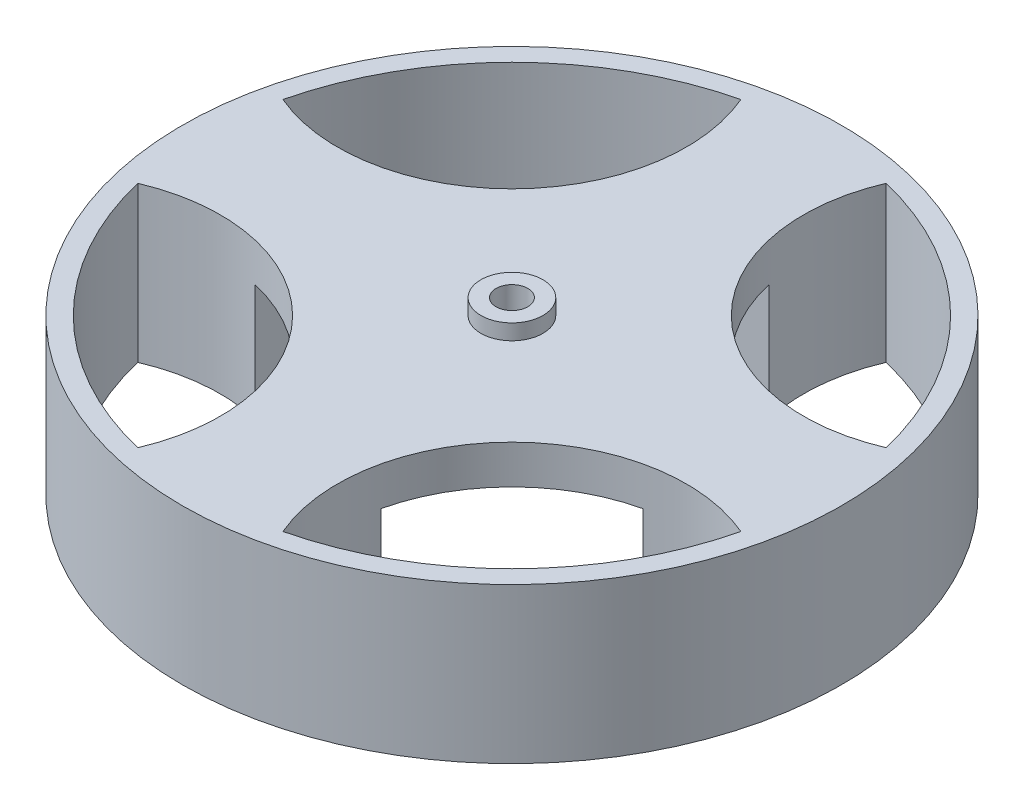
ISO-10303-21;
HEADER;
FILE_DESCRIPTION(('STEP AP214'),'2;1');
FILE_NAME('part.step','',(''),(''),'','','');
FILE_SCHEMA(('AUTOMOTIVE_DESIGN { 1 0 10303 214 1 1 1 1 }'));
ENDSEC;
DATA;
#1=APPLICATION_CONTEXT('core data for automotive mechanical design processes');
#2=APPLICATION_PROTOCOL_DEFINITION('international standard','automotive_design',2000,#1);
#3=PRODUCT_CONTEXT('',#1,'mechanical');
#4=PRODUCT('Part','Part','',(#3));
#5=PRODUCT_RELATED_PRODUCT_CATEGORY('part','',(#4));
#6=PRODUCT_DEFINITION_FORMATION('','',#4);
#7=PRODUCT_DEFINITION_CONTEXT('part definition',#1,'design');
#8=PRODUCT_DEFINITION('design','',#6,#7);
#9=PRODUCT_DEFINITION_SHAPE('','',#8);
#10=(LENGTH_UNIT() NAMED_UNIT(*) SI_UNIT(.MILLI.,.METRE.));
#11=(NAMED_UNIT(*) PLANE_ANGLE_UNIT() SI_UNIT($,.RADIAN.));
#12=(NAMED_UNIT(*) SI_UNIT($,.STERADIAN.) SOLID_ANGLE_UNIT());
#13=UNCERTAINTY_MEASURE_WITH_UNIT(LENGTH_MEASURE(1.E-05),#10,'distance_accuracy_value','');
#14=(GEOMETRIC_REPRESENTATION_CONTEXT(3) GLOBAL_UNCERTAINTY_ASSIGNED_CONTEXT((#13)) GLOBAL_UNIT_ASSIGNED_CONTEXT((#10,
#11,#12)) REPRESENTATION_CONTEXT('',''));
#15=CARTESIAN_POINT('',(0.,0.,0.));
#16=DIRECTION('',(0.,0.,1.));
#17=DIRECTION('',(1.,0.,0.));
#18=AXIS2_PLACEMENT_3D('',#15,#16,#17);
#19=CARTESIAN_POINT('',(0.,10.,0.));
#20=DIRECTION('',(0.,-1.,0.));
#21=DIRECTION('',(0.,0.,-1.));
#22=AXIS2_PLACEMENT_3D('',#19,#20,#21);
#23=CYLINDRICAL_SURFACE('',#22,40.);
#24=CARTESIAN_POINT('',(0.,-10.,0.));
#25=DIRECTION('',(0.,1.,0.));
#26=DIRECTION('',(0.,0.,1.));
#27=AXIS2_PLACEMENT_3D('',#24,#25,#26);
#28=CIRCLE('',#27,40.);
#29=CARTESIAN_POINT('',(-9.36023088988098,-10.,-38.8894082969659));
#30=VERTEX_POINT('',#29);
#31=CARTESIAN_POINT('',(-38.8894082969659,-10.,-9.36023088988067));
#32=VERTEX_POINT('',#31);
#33=EDGE_CURVE('E63',#30,#32,#28,.T.);
#34=ORIENTED_EDGE('',*,*,#33,.F.);
#35=DIRECTION('',(0.,1.,0.));
#36=VECTOR('',#35,1.);
#37=CARTESIAN_POINT('',(-9.36023088988108,5.,-38.8894082969658));
#38=LINE('',#37,#36);
#39=CARTESIAN_POINT('',(-9.36023088988108,10.,-38.8894082969658));
#40=VERTEX_POINT('',#39);
#41=EDGE_CURVE('E208',#30,#40,#38,.T.);
#42=ORIENTED_EDGE('',*,*,#41,.T.);
#43=CARTESIAN_POINT('',(0.,10.,0.));
#44=DIRECTION('',(0.,1.,0.));
#45=DIRECTION('',(0.,0.,1.));
#46=AXIS2_PLACEMENT_3D('',#43,#44,#45);
#47=CIRCLE('',#46,40.);
#48=CARTESIAN_POINT('',(-38.8894082969659,10.,-9.36023088988067));
#49=VERTEX_POINT('',#48);
#50=EDGE_CURVE('E578',#40,#49,#47,.T.);
#51=ORIENTED_EDGE('',*,*,#50,.T.);
#52=DIRECTION('',(0.,1.,0.));
#53=VECTOR('',#52,1.);
#54=CARTESIAN_POINT('',(-38.889408296966,5.,-9.36023088988068));
#55=LINE('',#54,#53);
#56=EDGE_CURVE('E205',#32,#49,#55,.T.);
#57=ORIENTED_EDGE('',*,*,#56,.F.);
#58=EDGE_LOOP('',(#34,#42,#51,#57));
#59=FACE_BOUND('',#58,.T.);
#60=ADVANCED_FACE('F38',(#59),#23,.F.);
#61=DIRECTION('',(0.,1.,0.));
#62=VECTOR('',#61,1.);
#63=CARTESIAN_POINT('',(9.36023088988079,5.,-38.8894082969659));
#64=LINE('',#63,#62);
#65=CARTESIAN_POINT('',(9.36023088988068,-10.,-38.889408296966));
#66=VERTEX_POINT('',#65);
#67=CARTESIAN_POINT('',(9.36023088988078,10.,-38.8894082969659));
#68=VERTEX_POINT('',#67);
#69=EDGE_CURVE('E211',#66,#68,#64,.T.);
#70=ORIENTED_EDGE('',*,*,#69,.F.);
#71=CARTESIAN_POINT('',(38.8894082969659,-10.,-9.36023088988097));
#72=VERTEX_POINT('',#71);
#73=EDGE_CURVE('E315',#72,#66,#28,.T.);
#74=ORIENTED_EDGE('',*,*,#73,.F.);
#75=DIRECTION('',(0.,1.,0.));
#76=VECTOR('',#75,1.);
#77=CARTESIAN_POINT('',(38.8894082969659,5.,-9.36023088988096));
#78=LINE('',#77,#76);
#79=CARTESIAN_POINT('',(38.8894082969659,10.,-9.36023088988096));
#80=VERTEX_POINT('',#79);
#81=EDGE_CURVE('E214',#72,#80,#78,.T.);
#82=ORIENTED_EDGE('',*,*,#81,.T.);
#83=EDGE_CURVE('E227',#80,#68,#47,.T.);
#84=ORIENTED_EDGE('',*,*,#83,.T.);
#85=EDGE_LOOP('',(#70,#74,#82,#84));
#86=FACE_BOUND('',#85,.T.);
#87=ADVANCED_FACE('F322',(#86),#23,.F.);
#88=CARTESIAN_POINT('',(-15.0260191002141,5.,15.0260191002142));
#89=DIRECTION('',(0.,1.,0.));
#90=DIRECTION('',(0.,0.,1.));
#91=AXIS2_PLACEMENT_3D('',#88,#89,#90);
#92=PLANE('',#91);
#93=CARTESIAN_POINT('',(0.,5.,0.));
#94=DIRECTION('',(0.,1.,0.));
#95=DIRECTION('',(0.,0.,1.));
#96=AXIS2_PLACEMENT_3D('',#93,#94,#95);
#97=CIRCLE('',#96,2.05);
#98=CARTESIAN_POINT('',(0.,5.,2.05));
#99=VERTEX_POINT('',#98);
#100=EDGE_CURVE('E42',#99,#99,#97,.T.);
#101=ORIENTED_EDGE('',*,*,#100,.T.);
#102=EDGE_LOOP('',(#101));
#103=FACE_BOUND('',#102,.T.);
#104=DIRECTION('',(-1.,0.,0.));
#105=VECTOR('',#104,1.);
#106=CARTESIAN_POINT('',(8.12655280052393,5.,-25.));
#107=LINE('',#106,#105);
#108=CARTESIAN_POINT('',(8.12655280052393,5.,-25.));
#109=VERTEX_POINT('',#108);
#110=CARTESIAN_POINT('',(-8.12655280052409,5.,-25.));
#111=VERTEX_POINT('',#110);
#112=EDGE_CURVE('E156',#109,#111,#107,.T.);
#113=ORIENTED_EDGE('',*,*,#112,.F.);
#114=CARTESIAN_POINT('',(30.0520382004282,5.,-30.0520382004283));
#115=DIRECTION('',(0.,-1.,0.));
#116=DIRECTION('',(0.,0.,1.));
#117=AXIS2_PLACEMENT_3D('',#114,#115,#116);
#118=CIRCLE('',#117,22.5);
#119=CARTESIAN_POINT('',(25.,5.,-8.12655280052409));
#120=VERTEX_POINT('',#119);
#121=EDGE_CURVE('E183',#120,#109,#118,.T.);
#122=ORIENTED_EDGE('',*,*,#121,.F.);
#123=DIRECTION('',(0.,0.,-1.));
#124=VECTOR('',#123,1.);
#125=CARTESIAN_POINT('',(25.,5.,8.12655280052393));
#126=LINE('',#125,#124);
#127=CARTESIAN_POINT('',(25.,5.,8.12655280052393));
#128=VERTEX_POINT('',#127);
#129=EDGE_CURVE('E292',#128,#120,#126,.T.);
#130=ORIENTED_EDGE('',*,*,#129,.F.);
#131=CARTESIAN_POINT('',(30.0520382004284,5.,30.0520382004281));
#132=DIRECTION('',(0.,-1.,0.));
#133=DIRECTION('',(0.,0.,1.));
#134=AXIS2_PLACEMENT_3D('',#131,#132,#133);
#135=CIRCLE('',#134,22.5);
#136=CARTESIAN_POINT('',(8.12655280052409,5.,25.));
#137=VERTEX_POINT('',#136);
#138=EDGE_CURVE('E187',#137,#128,#135,.T.);
#139=ORIENTED_EDGE('',*,*,#138,.F.);
#140=DIRECTION('',(1.,0.,0.));
#141=VECTOR('',#140,1.);
#142=CARTESIAN_POINT('',(-8.12655280052392,5.,25.));
#143=LINE('',#142,#141);
#144=CARTESIAN_POINT('',(-8.12655280052392,5.,25.));
#145=VERTEX_POINT('',#144);
#146=EDGE_CURVE('E254',#145,#137,#143,.T.);
#147=ORIENTED_EDGE('',*,*,#146,.F.);
#148=CARTESIAN_POINT('',(-30.0520382004282,5.,30.0520382004283));
#149=DIRECTION('',(0.,-1.,0.));
#150=DIRECTION('',(0.,0.,1.));
#151=AXIS2_PLACEMENT_3D('',#148,#149,#150);
#152=CIRCLE('',#151,22.5);
#153=CARTESIAN_POINT('',(-25.,5.,8.12655280052409));
#154=VERTEX_POINT('',#153);
#155=EDGE_CURVE('E204',#154,#145,#152,.T.);
#156=ORIENTED_EDGE('',*,*,#155,.F.);
#157=DIRECTION('',(0.,0.,1.));
#158=VECTOR('',#157,1.);
#159=CARTESIAN_POINT('',(-25.,5.,-8.12655280052392));
#160=LINE('',#159,#158);
#161=CARTESIAN_POINT('',(-25.,5.,-8.12655280052392));
#162=VERTEX_POINT('',#161);
#163=EDGE_CURVE('E181',#162,#154,#160,.T.);
#164=ORIENTED_EDGE('',*,*,#163,.F.);
#165=CARTESIAN_POINT('',(-30.0520382004284,5.,-30.0520382004281));
#166=DIRECTION('',(0.,-1.,0.));
#167=DIRECTION('',(0.,0.,1.));
#168=AXIS2_PLACEMENT_3D('',#165,#166,#167);
#169=CIRCLE('',#168,22.5);
#170=EDGE_CURVE('E175',#111,#162,#169,.T.);
#171=ORIENTED_EDGE('',*,*,#170,.F.);
#172=EDGE_LOOP('',(#113,#122,#130,#139,#147,#156,#164,#171));
#173=FACE_BOUND('',#172,.T.);
#174=ADVANCED_FACE('F179',(#103,#173),#92,.F.);
#175=DIRECTION('',(0.,1.,0.));
#176=VECTOR('',#175,1.);
#177=CARTESIAN_POINT('',(38.8894082969659,5.,9.36023088988063));
#178=LINE('',#177,#176);
#179=CARTESIAN_POINT('',(38.8894082969659,-10.,9.36023088988068));
#180=VERTEX_POINT('',#179);
#181=CARTESIAN_POINT('',(38.889408296966,10.,9.36023088988064));
#182=VERTEX_POINT('',#181);
#183=EDGE_CURVE('E217',#180,#182,#178,.T.);
#184=ORIENTED_EDGE('',*,*,#183,.F.);
#185=CARTESIAN_POINT('',(9.36023088988097,-10.,38.8894082969659));
#186=VERTEX_POINT('',#185);
#187=EDGE_CURVE('E231',#186,#180,#28,.T.);
#188=ORIENTED_EDGE('',*,*,#187,.F.);
#189=DIRECTION('',(0.,1.,0.));
#190=VECTOR('',#189,1.);
#191=CARTESIAN_POINT('',(9.36023088988111,5.,38.8894082969658));
#192=LINE('',#191,#190);
#193=CARTESIAN_POINT('',(9.36023088988111,10.,38.8894082969658));
#194=VERTEX_POINT('',#193);
#195=EDGE_CURVE('E220',#186,#194,#192,.T.);
#196=ORIENTED_EDGE('',*,*,#195,.T.);
#197=EDGE_CURVE('E225',#194,#182,#47,.T.);
#198=ORIENTED_EDGE('',*,*,#197,.T.);
#199=EDGE_LOOP('',(#184,#188,#196,#198));
#200=FACE_BOUND('',#199,.T.);
#201=ADVANCED_FACE('F314',(#200),#23,.F.);
#202=DIRECTION('',(0.,1.,0.));
#203=VECTOR('',#202,1.);
#204=CARTESIAN_POINT('',(-9.36023088988079,5.,38.8894082969659));
#205=LINE('',#204,#203);
#206=CARTESIAN_POINT('',(-9.36023088988067,-10.,38.8894082969659));
#207=VERTEX_POINT('',#206);
#208=CARTESIAN_POINT('',(-9.36023088988079,10.,38.8894082969659));
#209=VERTEX_POINT('',#208);
#210=EDGE_CURVE('E185',#207,#209,#205,.T.);
#211=ORIENTED_EDGE('',*,*,#210,.F.);
#212=CARTESIAN_POINT('',(-38.8894082969659,-10.,9.36023088988097));
#213=VERTEX_POINT('',#212);
#214=EDGE_CURVE('E229',#213,#207,#28,.T.);
#215=ORIENTED_EDGE('',*,*,#214,.F.);
#216=DIRECTION('',(0.,1.,0.));
#217=VECTOR('',#216,1.);
#218=CARTESIAN_POINT('',(-38.8894082969659,5.,9.36023088988096));
#219=LINE('',#218,#217);
#220=CARTESIAN_POINT('',(-38.8894082969659,10.,9.36023088988096));
#221=VERTEX_POINT('',#220);
#222=EDGE_CURVE('E55',#213,#221,#219,.T.);
#223=ORIENTED_EDGE('',*,*,#222,.T.);
#224=EDGE_CURVE('E228',#221,#209,#47,.T.);
#225=ORIENTED_EDGE('',*,*,#224,.T.);
#226=EDGE_LOOP('',(#211,#215,#223,#225));
#227=FACE_BOUND('',#226,.T.);
#228=ADVANCED_FACE('F245',(#227),#23,.F.);
#229=CARTESIAN_POINT('',(0.,10.,0.));
#230=DIRECTION('',(0.,1.,0.));
#231=DIRECTION('',(0.,0.,1.));
#232=AXIS2_PLACEMENT_3D('',#229,#230,#231);
#233=PLANE('',#232);
#234=CARTESIAN_POINT('',(0.,10.,0.));
#235=DIRECTION('',(0.,1.,0.));
#236=DIRECTION('',(0.,0.,1.));
#237=AXIS2_PLACEMENT_3D('',#234,#235,#236);
#238=CIRCLE('',#237,4.);
#239=CARTESIAN_POINT('',(0.,10.,4.));
#240=VERTEX_POINT('',#239);
#241=EDGE_CURVE('E274',#240,#240,#238,.T.);
#242=ORIENTED_EDGE('',*,*,#241,.F.);
#243=EDGE_LOOP('',(#242));
#244=FACE_BOUND('',#243,.T.);
#245=ORIENTED_EDGE('',*,*,#83,.F.);
#246=CARTESIAN_POINT('',(30.0520382004282,10.,-30.0520382004283));
#247=DIRECTION('',(0.,-1.,0.));
#248=DIRECTION('',(0.,0.,1.));
#249=AXIS2_PLACEMENT_3D('',#246,#247,#248);
#250=CIRCLE('',#249,22.5);
#251=EDGE_CURVE('E198',#80,#68,#250,.T.);
#252=ORIENTED_EDGE('',*,*,#251,.T.);
#253=EDGE_LOOP('',(#245,#252));
#254=FACE_BOUND('',#253,.T.);
#255=ORIENTED_EDGE('',*,*,#50,.F.);
#256=CARTESIAN_POINT('',(-30.0520382004284,10.,-30.0520382004281));
#257=DIRECTION('',(0.,-1.,0.));
#258=DIRECTION('',(0.,0.,1.));
#259=AXIS2_PLACEMENT_3D('',#256,#257,#258);
#260=CIRCLE('',#259,22.5);
#261=EDGE_CURVE('E201',#40,#49,#260,.T.);
#262=ORIENTED_EDGE('',*,*,#261,.T.);
#263=EDGE_LOOP('',(#255,#262));
#264=FACE_BOUND('',#263,.T.);
#265=ORIENTED_EDGE('',*,*,#224,.F.);
#266=CARTESIAN_POINT('',(-30.0520382004282,10.,30.0520382004283));
#267=DIRECTION('',(0.,-1.,0.));
#268=DIRECTION('',(0.,0.,1.));
#269=AXIS2_PLACEMENT_3D('',#266,#267,#268);
#270=CIRCLE('',#269,22.5);
#271=EDGE_CURVE('E191',#221,#209,#270,.T.);
#272=ORIENTED_EDGE('',*,*,#271,.T.);
#273=EDGE_LOOP('',(#265,#272));
#274=FACE_BOUND('',#273,.T.);
#275=CARTESIAN_POINT('',(0.,10.,0.));
#276=DIRECTION('',(0.,1.,0.));
#277=DIRECTION('',(0.,0.,1.));
#278=AXIS2_PLACEMENT_3D('',#275,#276,#277);
#279=CIRCLE('',#278,42.5);
#280=CARTESIAN_POINT('',(0.,10.,42.5));
#281=VERTEX_POINT('',#280);
#282=EDGE_CURVE('E11',#281,#281,#279,.T.);
#283=ORIENTED_EDGE('',*,*,#282,.T.);
#284=EDGE_LOOP('',(#283));
#285=FACE_BOUND('',#284,.T.);
#286=ORIENTED_EDGE('',*,*,#197,.F.);
#287=CARTESIAN_POINT('',(30.0520382004284,10.,30.0520382004281));
#288=DIRECTION('',(0.,-1.,0.));
#289=DIRECTION('',(0.,0.,1.));
#290=AXIS2_PLACEMENT_3D('',#287,#288,#289);
#291=CIRCLE('',#290,22.5);
#292=EDGE_CURVE('E194',#194,#182,#291,.T.);
#293=ORIENTED_EDGE('',*,*,#292,.T.);
#294=EDGE_LOOP('',(#286,#293));
#295=FACE_BOUND('',#294,.T.);
#296=ADVANCED_FACE('F238',(#244,#254,#264,#274,#285,#295),#233,.T.);
#297=CARTESIAN_POINT('',(0.,-10.,0.));
#298=DIRECTION('',(0.,1.,0.));
#299=DIRECTION('',(0.,0.,1.));
#300=AXIS2_PLACEMENT_3D('',#297,#298,#299);
#301=PLANE('',#300);
#302=CARTESIAN_POINT('',(0.,-10.,0.));
#303=DIRECTION('',(0.,1.,0.));
#304=DIRECTION('',(0.,0.,1.));
#305=AXIS2_PLACEMENT_3D('',#302,#303,#304);
#306=CIRCLE('',#305,42.5);
#307=CARTESIAN_POINT('',(0.,-10.,42.5));
#308=VERTEX_POINT('',#307);
#309=EDGE_CURVE('E47',#308,#308,#306,.T.);
#310=ORIENTED_EDGE('',*,*,#309,.F.);
#311=EDGE_LOOP('',(#310));
#312=FACE_BOUND('',#311,.T.);
#313=ORIENTED_EDGE('',*,*,#214,.T.);
#314=CARTESIAN_POINT('',(-30.0520382004281,-10.,30.0520382004284));
#315=DIRECTION('',(0.,1.,0.));
#316=DIRECTION('',(0.,0.,-1.));
#317=AXIS2_PLACEMENT_3D('',#314,#315,#316);
#318=CIRCLE('',#317,22.5);
#319=CARTESIAN_POINT('',(-8.12655280052392,-10.,25.));
#320=VERTEX_POINT('',#319);
#321=EDGE_CURVE('E241',#207,#320,#318,.T.);
#322=ORIENTED_EDGE('',*,*,#321,.T.);
#323=DIRECTION('',(1.,0.,0.));
#324=VECTOR('',#323,1.);
#325=CARTESIAN_POINT('',(-8.12655280052392,-10.,25.));
#326=LINE('',#325,#324);
#327=CARTESIAN_POINT('',(8.12655280052409,-10.,25.));
#328=VERTEX_POINT('',#327);
#329=EDGE_CURVE('E251',#320,#328,#326,.T.);
#330=ORIENTED_EDGE('',*,*,#329,.T.);
#331=CARTESIAN_POINT('',(30.0520382004283,-10.,30.0520382004282));
#332=DIRECTION('',(0.,1.,0.));
#333=DIRECTION('',(0.,0.,-1.));
#334=AXIS2_PLACEMENT_3D('',#331,#332,#333);
#335=CIRCLE('',#334,22.5);
#336=EDGE_CURVE('E250',#328,#186,#335,.T.);
#337=ORIENTED_EDGE('',*,*,#336,.T.);
#338=ORIENTED_EDGE('',*,*,#187,.T.);
#339=CARTESIAN_POINT('',(30.0520382004284,-10.,30.0520382004281));
#340=DIRECTION('',(0.,1.,0.));
#341=DIRECTION('',(0.,0.,-1.));
#342=AXIS2_PLACEMENT_3D('',#339,#340,#341);
#343=CIRCLE('',#342,22.5);
#344=CARTESIAN_POINT('',(25.,-10.,8.12655280052393));
#345=VERTEX_POINT('',#344);
#346=EDGE_CURVE('E300',#180,#345,#343,.T.);
#347=ORIENTED_EDGE('',*,*,#346,.T.);
#348=DIRECTION('',(0.,0.,-1.));
#349=VECTOR('',#348,1.);
#350=CARTESIAN_POINT('',(25.,-10.,8.12655280052393));
#351=LINE('',#350,#349);
#352=CARTESIAN_POINT('',(25.,-10.,-8.12655280052409));
#353=VERTEX_POINT('',#352);
#354=EDGE_CURVE('E306',#345,#353,#351,.T.);
#355=ORIENTED_EDGE('',*,*,#354,.T.);
#356=CARTESIAN_POINT('',(30.0520382004282,-10.,-30.0520382004283));
#357=DIRECTION('',(0.,1.,0.));
#358=DIRECTION('',(0.,0.,-1.));
#359=AXIS2_PLACEMENT_3D('',#356,#357,#358);
#360=CIRCLE('',#359,22.5);
#361=EDGE_CURVE('E296',#353,#72,#360,.T.);
#362=ORIENTED_EDGE('',*,*,#361,.T.);
#363=ORIENTED_EDGE('',*,*,#73,.T.);
#364=CARTESIAN_POINT('',(30.0520382004281,-10.,-30.0520382004284));
#365=DIRECTION('',(0.,1.,0.));
#366=DIRECTION('',(0.,0.,-1.));
#367=AXIS2_PLACEMENT_3D('',#364,#365,#366);
#368=CIRCLE('',#367,22.5);
#369=CARTESIAN_POINT('',(8.12655280052393,-10.,-25.));
#370=VERTEX_POINT('',#369);
#371=EDGE_CURVE('E319',#66,#370,#368,.T.);
#372=ORIENTED_EDGE('',*,*,#371,.T.);
#373=DIRECTION('',(-1.,0.,0.));
#374=VECTOR('',#373,1.);
#375=CARTESIAN_POINT('',(8.12655280052393,-10.,-25.));
#376=LINE('',#375,#374);
#377=CARTESIAN_POINT('',(-8.12655280052409,-10.,-25.));
#378=VERTEX_POINT('',#377);
#379=EDGE_CURVE('E177',#370,#378,#376,.T.);
#380=ORIENTED_EDGE('',*,*,#379,.T.);
#381=CARTESIAN_POINT('',(-30.0520382004283,-10.,-30.0520382004282));
#382=DIRECTION('',(0.,1.,0.));
#383=DIRECTION('',(0.,0.,-1.));
#384=AXIS2_PLACEMENT_3D('',#381,#382,#383);
#385=CIRCLE('',#384,22.5);
#386=EDGE_CURVE('E169',#378,#30,#385,.T.);
#387=ORIENTED_EDGE('',*,*,#386,.T.);
#388=ORIENTED_EDGE('',*,*,#33,.T.);
#389=CARTESIAN_POINT('',(-30.0520382004284,-10.,-30.0520382004281));
#390=DIRECTION('',(0.,1.,0.));
#391=DIRECTION('',(0.,0.,-1.));
#392=AXIS2_PLACEMENT_3D('',#389,#390,#391);
#393=CIRCLE('',#392,22.5);
#394=CARTESIAN_POINT('',(-25.,-10.,-8.12655280052392));
#395=VERTEX_POINT('',#394);
#396=EDGE_CURVE('E261',#32,#395,#393,.T.);
#397=ORIENTED_EDGE('',*,*,#396,.T.);
#398=DIRECTION('',(0.,0.,1.));
#399=VECTOR('',#398,1.);
#400=CARTESIAN_POINT('',(-25.,-10.,-8.12655280052392));
#401=LINE('',#400,#399);
#402=CARTESIAN_POINT('',(-25.,-10.,8.12655280052409));
#403=VERTEX_POINT('',#402);
#404=EDGE_CURVE('E263',#395,#403,#401,.T.);
#405=ORIENTED_EDGE('',*,*,#404,.T.);
#406=CARTESIAN_POINT('',(-30.0520382004282,-10.,30.0520382004283));
#407=DIRECTION('',(0.,1.,0.));
#408=DIRECTION('',(0.,0.,-1.));
#409=AXIS2_PLACEMENT_3D('',#406,#407,#408);
#410=CIRCLE('',#409,22.5);
#411=EDGE_CURVE('E243',#403,#213,#410,.T.);
#412=ORIENTED_EDGE('',*,*,#411,.T.);
#413=EDGE_LOOP('',(#313,#322,#330,#337,#338,#347,#355,#362,#363,#372,#380,#387,#388,#397,#405,#412));
#414=FACE_BOUND('',#413,.T.);
#415=ADVANCED_FACE('F236',(#312,#414),#301,.F.);
#416=CARTESIAN_POINT('',(0.,10.,0.));
#417=DIRECTION('',(0.,-1.,0.));
#418=DIRECTION('',(0.,0.,-1.));
#419=AXIS2_PLACEMENT_3D('',#416,#417,#418);
#420=CYLINDRICAL_SURFACE('',#419,42.5);
#421=ORIENTED_EDGE('',*,*,#282,.F.);
#422=EDGE_LOOP('',(#421));
#423=FACE_BOUND('',#422,.T.);
#424=ORIENTED_EDGE('',*,*,#309,.T.);
#425=EDGE_LOOP('',(#424));
#426=FACE_BOUND('',#425,.T.);
#427=ADVANCED_FACE('F40',(#423,#426),#420,.T.);
#428=CARTESIAN_POINT('',(-30.0520382004284,5.,-30.0520382004281));
#429=DIRECTION('',(0.,1.,0.));
#430=DIRECTION('',(0.,0.,1.));
#431=AXIS2_PLACEMENT_3D('',#428,#429,#430);
#432=CYLINDRICAL_SURFACE('',#431,22.5);
#433=ORIENTED_EDGE('',*,*,#261,.F.);
#434=ORIENTED_EDGE('',*,*,#41,.F.);
#435=ORIENTED_EDGE('',*,*,#386,.F.);
#436=DIRECTION('',(0.,1.,0.));
#437=VECTOR('',#436,1.);
#438=CARTESIAN_POINT('',(-8.12655280052409,-10.,-25.));
#439=LINE('',#438,#437);
#440=EDGE_CURVE('E160',#378,#111,#439,.T.);
#441=ORIENTED_EDGE('',*,*,#440,.T.);
#442=ORIENTED_EDGE('',*,*,#170,.T.);
#443=DIRECTION('',(0.,1.,0.));
#444=VECTOR('',#443,1.);
#445=CARTESIAN_POINT('',(-25.,-10.,-8.12655280052392));
#446=LINE('',#445,#444);
#447=EDGE_CURVE('E269',#395,#162,#446,.T.);
#448=ORIENTED_EDGE('',*,*,#447,.F.);
#449=ORIENTED_EDGE('',*,*,#396,.F.);
#450=ORIENTED_EDGE('',*,*,#56,.T.);
#451=EDGE_LOOP('',(#433,#434,#435,#441,#442,#448,#449,#450));
#452=FACE_BOUND('',#451,.T.);
#453=ADVANCED_FACE('F173',(#452),#432,.F.);
#454=CARTESIAN_POINT('',(30.0520382004282,5.,-30.0520382004283));
#455=DIRECTION('',(0.,1.,0.));
#456=DIRECTION('',(0.,0.,1.));
#457=AXIS2_PLACEMENT_3D('',#454,#455,#456);
#458=CYLINDRICAL_SURFACE('',#457,22.5);
#459=ORIENTED_EDGE('',*,*,#251,.F.);
#460=ORIENTED_EDGE('',*,*,#81,.F.);
#461=ORIENTED_EDGE('',*,*,#361,.F.);
#462=DIRECTION('',(0.,1.,0.));
#463=VECTOR('',#462,1.);
#464=CARTESIAN_POINT('',(25.,-10.,-8.12655280052409));
#465=LINE('',#464,#463);
#466=EDGE_CURVE('E304',#353,#120,#465,.T.);
#467=ORIENTED_EDGE('',*,*,#466,.T.);
#468=ORIENTED_EDGE('',*,*,#121,.T.);
#469=DIRECTION('',(0.,1.,0.));
#470=VECTOR('',#469,1.);
#471=CARTESIAN_POINT('',(8.12655280052393,-10.,-25.));
#472=LINE('',#471,#470);
#473=EDGE_CURVE('E163',#370,#109,#472,.T.);
#474=ORIENTED_EDGE('',*,*,#473,.F.);
#475=ORIENTED_EDGE('',*,*,#371,.F.);
#476=ORIENTED_EDGE('',*,*,#69,.T.);
#477=EDGE_LOOP('',(#459,#460,#461,#467,#468,#474,#475,#476));
#478=FACE_BOUND('',#477,.T.);
#479=ADVANCED_FACE('F325',(#478),#458,.F.);
#480=CARTESIAN_POINT('',(30.0520382004284,5.,30.0520382004281));
#481=DIRECTION('',(0.,1.,0.));
#482=DIRECTION('',(0.,0.,1.));
#483=AXIS2_PLACEMENT_3D('',#480,#481,#482);
#484=CYLINDRICAL_SURFACE('',#483,22.5);
#485=ORIENTED_EDGE('',*,*,#292,.F.);
#486=ORIENTED_EDGE('',*,*,#195,.F.);
#487=ORIENTED_EDGE('',*,*,#336,.F.);
#488=DIRECTION('',(0.,1.,0.));
#489=VECTOR('',#488,1.);
#490=CARTESIAN_POINT('',(8.12655280052409,-10.,25.));
#491=LINE('',#490,#489);
#492=EDGE_CURVE('E256',#328,#137,#491,.T.);
#493=ORIENTED_EDGE('',*,*,#492,.T.);
#494=ORIENTED_EDGE('',*,*,#138,.T.);
#495=DIRECTION('',(0.,1.,0.));
#496=VECTOR('',#495,1.);
#497=CARTESIAN_POINT('',(25.,-10.,8.12655280052393));
#498=LINE('',#497,#496);
#499=EDGE_CURVE('E168',#345,#128,#498,.T.);
#500=ORIENTED_EDGE('',*,*,#499,.F.);
#501=ORIENTED_EDGE('',*,*,#346,.F.);
#502=ORIENTED_EDGE('',*,*,#183,.T.);
#503=EDGE_LOOP('',(#485,#486,#487,#493,#494,#500,#501,#502));
#504=FACE_BOUND('',#503,.T.);
#505=ADVANCED_FACE('F285',(#504),#484,.F.);
#506=CARTESIAN_POINT('',(-30.0520382004282,5.,30.0520382004283));
#507=DIRECTION('',(0.,1.,0.));
#508=DIRECTION('',(0.,0.,1.));
#509=AXIS2_PLACEMENT_3D('',#506,#507,#508);
#510=CYLINDRICAL_SURFACE('',#509,22.5);
#511=ORIENTED_EDGE('',*,*,#271,.F.);
#512=ORIENTED_EDGE('',*,*,#222,.F.);
#513=ORIENTED_EDGE('',*,*,#411,.F.);
#514=DIRECTION('',(0.,1.,0.));
#515=VECTOR('',#514,1.);
#516=CARTESIAN_POINT('',(-25.,-10.,8.12655280052409));
#517=LINE('',#516,#515);
#518=EDGE_CURVE('E265',#403,#154,#517,.T.);
#519=ORIENTED_EDGE('',*,*,#518,.T.);
#520=ORIENTED_EDGE('',*,*,#155,.T.);
#521=DIRECTION('',(0.,1.,0.));
#522=VECTOR('',#521,1.);
#523=CARTESIAN_POINT('',(-8.12655280052392,-10.,25.));
#524=LINE('',#523,#522);
#525=EDGE_CURVE('E248',#320,#145,#524,.T.);
#526=ORIENTED_EDGE('',*,*,#525,.F.);
#527=ORIENTED_EDGE('',*,*,#321,.F.);
#528=ORIENTED_EDGE('',*,*,#210,.T.);
#529=EDGE_LOOP('',(#511,#512,#513,#519,#520,#526,#527,#528));
#530=FACE_BOUND('',#529,.T.);
#531=ADVANCED_FACE('F246',(#530),#510,.F.);
#532=CARTESIAN_POINT('',(0.,12.,0.));
#533=DIRECTION('',(0.,1.,0.));
#534=DIRECTION('',(0.,0.,1.));
#535=AXIS2_PLACEMENT_3D('',#532,#533,#534);
#536=PLANE('',#535);
#537=CARTESIAN_POINT('',(0.,12.,0.));
#538=DIRECTION('',(0.,1.,0.));
#539=DIRECTION('',(0.,0.,1.));
#540=AXIS2_PLACEMENT_3D('',#537,#538,#539);
#541=CIRCLE('',#540,4.);
#542=CARTESIAN_POINT('',(0.,12.,4.));
#543=VERTEX_POINT('',#542);
#544=EDGE_CURVE('E195',#543,#543,#541,.T.);
#545=ORIENTED_EDGE('',*,*,#544,.T.);
#546=EDGE_LOOP('',(#545));
#547=FACE_BOUND('',#546,.T.);
#548=CARTESIAN_POINT('',(0.,12.,0.));
#549=DIRECTION('',(0.,1.,0.));
#550=DIRECTION('',(0.,0.,1.));
#551=AXIS2_PLACEMENT_3D('',#548,#549,#550);
#552=CIRCLE('',#551,2.05);
#553=CARTESIAN_POINT('',(0.,12.,2.05));
#554=VERTEX_POINT('',#553);
#555=EDGE_CURVE('E271',#554,#554,#552,.T.);
#556=ORIENTED_EDGE('',*,*,#555,.F.);
#557=EDGE_LOOP('',(#556));
#558=FACE_BOUND('',#557,.T.);
#559=ADVANCED_FACE('F348',(#547,#558),#536,.T.);
#560=CARTESIAN_POINT('',(0.,12.,0.));
#561=DIRECTION('',(0.,-1.,0.));
#562=DIRECTION('',(0.,0.,-1.));
#563=AXIS2_PLACEMENT_3D('',#560,#561,#562);
#564=CYLINDRICAL_SURFACE('',#563,4.);
#565=ORIENTED_EDGE('',*,*,#544,.F.);
#566=EDGE_LOOP('',(#565));
#567=FACE_BOUND('',#566,.T.);
#568=ORIENTED_EDGE('',*,*,#241,.T.);
#569=EDGE_LOOP('',(#568));
#570=FACE_BOUND('',#569,.T.);
#571=ADVANCED_FACE('F358',(#567,#570),#564,.T.);
#572=CARTESIAN_POINT('',(0.,12.,0.));
#573=DIRECTION('',(0.,-1.,0.));
#574=DIRECTION('',(0.,0.,-1.));
#575=AXIS2_PLACEMENT_3D('',#572,#573,#574);
#576=CYLINDRICAL_SURFACE('',#575,2.05);
#577=ORIENTED_EDGE('',*,*,#555,.T.);
#578=EDGE_LOOP('',(#577));
#579=FACE_BOUND('',#578,.T.);
#580=ORIENTED_EDGE('',*,*,#100,.F.);
#581=EDGE_LOOP('',(#580));
#582=FACE_BOUND('',#581,.T.);
#583=ADVANCED_FACE('F361',(#579,#582),#576,.F.);
#584=CARTESIAN_POINT('',(-25.,-10.,-8.12655280052392));
#585=DIRECTION('',(-1.,0.,0.));
#586=DIRECTION('',(0.,0.,1.));
#587=AXIS2_PLACEMENT_3D('',#584,#585,#586);
#588=PLANE('',#587);
#589=ORIENTED_EDGE('',*,*,#163,.T.);
#590=ORIENTED_EDGE('',*,*,#518,.F.);
#591=ORIENTED_EDGE('',*,*,#404,.F.);
#592=ORIENTED_EDGE('',*,*,#447,.T.);
#593=EDGE_LOOP('',(#589,#590,#591,#592));
#594=FACE_BOUND('',#593,.T.);
#595=ADVANCED_FACE('F368',(#594),#588,.F.);
#596=CARTESIAN_POINT('',(-8.12655280052392,-10.,25.));
#597=DIRECTION('',(0.,0.,1.));
#598=DIRECTION('',(1.,0.,0.));
#599=AXIS2_PLACEMENT_3D('',#596,#597,#598);
#600=PLANE('',#599);
#601=ORIENTED_EDGE('',*,*,#146,.T.);
#602=ORIENTED_EDGE('',*,*,#492,.F.);
#603=ORIENTED_EDGE('',*,*,#329,.F.);
#604=ORIENTED_EDGE('',*,*,#525,.T.);
#605=EDGE_LOOP('',(#601,#602,#603,#604));
#606=FACE_BOUND('',#605,.T.);
#607=ADVANCED_FACE('F310',(#606),#600,.F.);
#608=CARTESIAN_POINT('',(25.,-10.,8.12655280052393));
#609=DIRECTION('',(1.,0.,0.));
#610=DIRECTION('',(0.,0.,-1.));
#611=AXIS2_PLACEMENT_3D('',#608,#609,#610);
#612=PLANE('',#611);
#613=ORIENTED_EDGE('',*,*,#129,.T.);
#614=ORIENTED_EDGE('',*,*,#466,.F.);
#615=ORIENTED_EDGE('',*,*,#354,.F.);
#616=ORIENTED_EDGE('',*,*,#499,.T.);
#617=EDGE_LOOP('',(#613,#614,#615,#616));
#618=FACE_BOUND('',#617,.T.);
#619=ADVANCED_FACE('F329',(#618),#612,.F.);
#620=CARTESIAN_POINT('',(8.12655280052393,-10.,-25.));
#621=DIRECTION('',(0.,0.,-1.));
#622=DIRECTION('',(-1.,0.,0.));
#623=AXIS2_PLACEMENT_3D('',#620,#621,#622);
#624=PLANE('',#623);
#625=ORIENTED_EDGE('',*,*,#112,.T.);
#626=ORIENTED_EDGE('',*,*,#440,.F.);
#627=ORIENTED_EDGE('',*,*,#379,.F.);
#628=ORIENTED_EDGE('',*,*,#473,.T.);
#629=EDGE_LOOP('',(#625,#626,#627,#628));
#630=FACE_BOUND('',#629,.T.);
#631=ADVANCED_FACE('F158',(#630),#624,.F.);
#632=CLOSED_SHELL('',(#60,#87,#174,#201,#228,#296,#415,#427,#453,#479,#505,#531,#559,#571,#583,
#595,#607,#619,#631));
#633=MANIFOLD_SOLID_BREP('B2',#632);
#634=ADVANCED_BREP_SHAPE_REPRESENTATION('',(#18,#633),#14);
#635=SHAPE_DEFINITION_REPRESENTATION(#9,#634);
ENDSEC;
END-ISO-10303-21;
